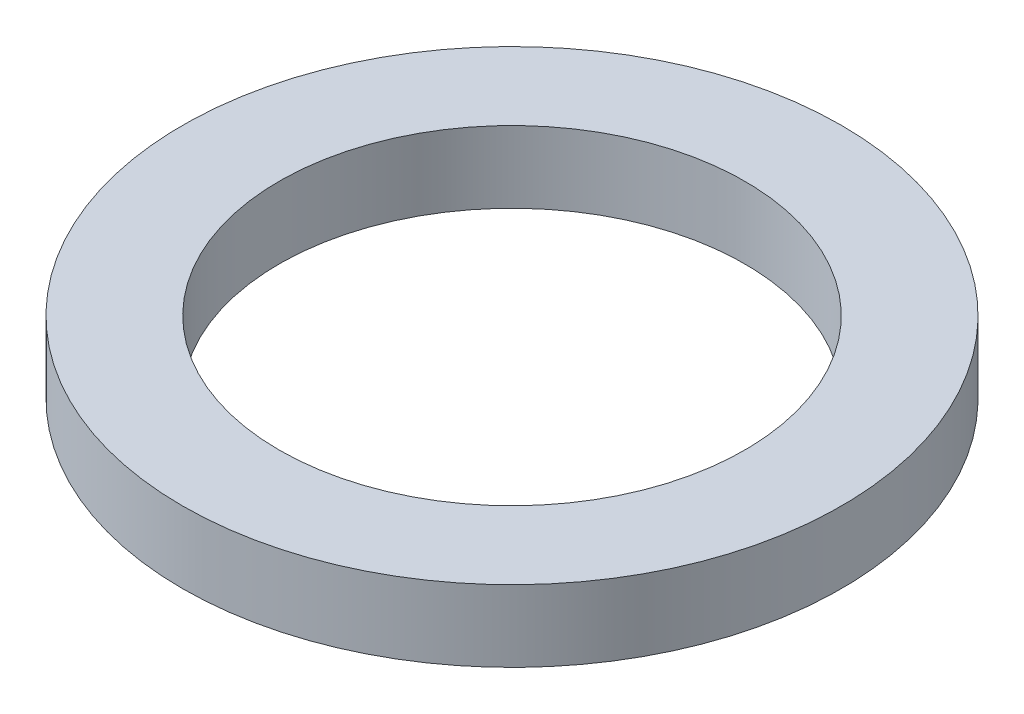
ISO-10303-21;
HEADER;
FILE_DESCRIPTION(('STEP AP214'),'2;1');
FILE_NAME('part.step','',(''),(''),'','','');
FILE_SCHEMA(('AUTOMOTIVE_DESIGN { 1 0 10303 214 1 1 1 1 }'));
ENDSEC;
DATA;
#1=APPLICATION_CONTEXT('core data for automotive mechanical design processes');
#2=APPLICATION_PROTOCOL_DEFINITION('international standard','automotive_design',2000,#1);
#3=PRODUCT_CONTEXT('',#1,'mechanical');
#4=PRODUCT('Part','Part','',(#3));
#5=PRODUCT_RELATED_PRODUCT_CATEGORY('part','',(#4));
#6=PRODUCT_DEFINITION_FORMATION('','',#4);
#7=PRODUCT_DEFINITION_CONTEXT('part definition',#1,'design');
#8=PRODUCT_DEFINITION('design','',#6,#7);
#9=PRODUCT_DEFINITION_SHAPE('','',#8);
#10=(LENGTH_UNIT() NAMED_UNIT(*) SI_UNIT(.MILLI.,.METRE.));
#11=(NAMED_UNIT(*) PLANE_ANGLE_UNIT() SI_UNIT($,.RADIAN.));
#12=(NAMED_UNIT(*) SI_UNIT($,.STERADIAN.) SOLID_ANGLE_UNIT());
#13=UNCERTAINTY_MEASURE_WITH_UNIT(LENGTH_MEASURE(1.E-05),#10,'distance_accuracy_value','');
#14=(GEOMETRIC_REPRESENTATION_CONTEXT(3) GLOBAL_UNCERTAINTY_ASSIGNED_CONTEXT((#13)) GLOBAL_UNIT_ASSIGNED_CONTEXT((#10,
#11,#12)) REPRESENTATION_CONTEXT('',''));
#15=CARTESIAN_POINT('',(0.,0.,0.));
#16=DIRECTION('',(0.,0.,1.));
#17=DIRECTION('',(1.,0.,0.));
#18=AXIS2_PLACEMENT_3D('',#15,#16,#17);
#19=CARTESIAN_POINT('',(0.,6.35,0.));
#20=DIRECTION('',(0.,1.,0.));
#21=DIRECTION('',(0.,0.,1.));
#22=AXIS2_PLACEMENT_3D('',#19,#20,#21);
#23=PLANE('',#22);
#24=CARTESIAN_POINT('',(0.,6.35,0.));
#25=DIRECTION('',(0.,1.,0.));
#26=DIRECTION('',(0.,0.,1.));
#27=AXIS2_PLACEMENT_3D('',#24,#25,#26);
#28=CIRCLE('',#27,29.21);
#29=CARTESIAN_POINT('',(0.,6.35,29.21));
#30=VERTEX_POINT('',#29);
#31=EDGE_CURVE('E10',#30,#30,#28,.T.);
#32=ORIENTED_EDGE('',*,*,#31,.T.);
#33=EDGE_LOOP('',(#32));
#34=FACE_BOUND('',#33,.T.);
#35=CARTESIAN_POINT('',(0.,6.35,0.));
#36=DIRECTION('',(0.,1.,0.));
#37=DIRECTION('',(0.,0.,1.));
#38=AXIS2_PLACEMENT_3D('',#35,#36,#37);
#39=CIRCLE('',#38,20.6375);
#40=CARTESIAN_POINT('',(0.,6.35,20.6375));
#41=VERTEX_POINT('',#40);
#42=EDGE_CURVE('E54',#41,#41,#39,.T.);
#43=ORIENTED_EDGE('',*,*,#42,.F.);
#44=EDGE_LOOP('',(#43));
#45=FACE_BOUND('',#44,.T.);
#46=ADVANCED_FACE('F41',(#34,#45),#23,.T.);
#47=CARTESIAN_POINT('',(0.,0.,0.));
#48=DIRECTION('',(0.,1.,0.));
#49=DIRECTION('',(0.,0.,1.));
#50=AXIS2_PLACEMENT_3D('',#47,#48,#49);
#51=PLANE('',#50);
#52=CARTESIAN_POINT('',(0.,0.,0.));
#53=DIRECTION('',(0.,1.,0.));
#54=DIRECTION('',(0.,0.,1.));
#55=AXIS2_PLACEMENT_3D('',#52,#53,#54);
#56=CIRCLE('',#55,29.21);
#57=CARTESIAN_POINT('',(0.,0.,29.21));
#58=VERTEX_POINT('',#57);
#59=EDGE_CURVE('E45',#58,#58,#56,.T.);
#60=ORIENTED_EDGE('',*,*,#59,.F.);
#61=EDGE_LOOP('',(#60));
#62=FACE_BOUND('',#61,.T.);
#63=CARTESIAN_POINT('',(0.,0.,0.));
#64=DIRECTION('',(0.,1.,0.));
#65=DIRECTION('',(0.,0.,1.));
#66=AXIS2_PLACEMENT_3D('',#63,#64,#65);
#67=CIRCLE('',#66,20.6375);
#68=CARTESIAN_POINT('',(0.,0.,20.6375));
#69=VERTEX_POINT('',#68);
#70=EDGE_CURVE('E56',#69,#69,#67,.T.);
#71=ORIENTED_EDGE('',*,*,#70,.T.);
#72=EDGE_LOOP('',(#71));
#73=FACE_BOUND('',#72,.T.);
#74=ADVANCED_FACE('F68',(#62,#73),#51,.F.);
#75=CARTESIAN_POINT('',(0.,6.35,0.));
#76=DIRECTION('',(0.,-1.,0.));
#77=DIRECTION('',(0.,0.,-1.));
#78=AXIS2_PLACEMENT_3D('',#75,#76,#77);
#79=CYLINDRICAL_SURFACE('',#78,29.21);
#80=ORIENTED_EDGE('',*,*,#31,.F.);
#81=EDGE_LOOP('',(#80));
#82=FACE_BOUND('',#81,.T.);
#83=ORIENTED_EDGE('',*,*,#59,.T.);
#84=EDGE_LOOP('',(#83));
#85=FACE_BOUND('',#84,.T.);
#86=ADVANCED_FACE('F43',(#82,#85),#79,.T.);
#87=CARTESIAN_POINT('',(0.,6.35,0.));
#88=DIRECTION('',(0.,-1.,0.));
#89=DIRECTION('',(0.,0.,-1.));
#90=AXIS2_PLACEMENT_3D('',#87,#88,#89);
#91=CYLINDRICAL_SURFACE('',#90,20.6375);
#92=ORIENTED_EDGE('',*,*,#42,.T.);
#93=EDGE_LOOP('',(#92));
#94=FACE_BOUND('',#93,.T.);
#95=ORIENTED_EDGE('',*,*,#70,.F.);
#96=EDGE_LOOP('',(#95));
#97=FACE_BOUND('',#96,.T.);
#98=ADVANCED_FACE('F64',(#94,#97),#91,.F.);
#99=CLOSED_SHELL('',(#46,#74,#86,#98));
#100=MANIFOLD_SOLID_BREP('B2',#99);
#101=ADVANCED_BREP_SHAPE_REPRESENTATION('',(#18,#100),#14);
#102=SHAPE_DEFINITION_REPRESENTATION(#9,#101);
ENDSEC;
END-ISO-10303-21;
